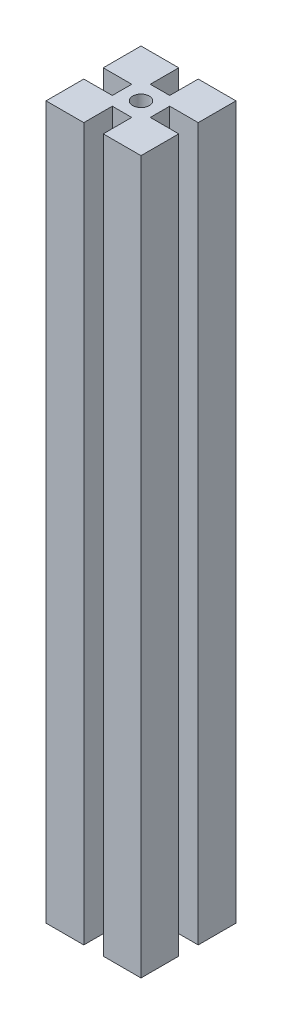
ISO-10303-21;
HEADER;
FILE_DESCRIPTION(('STEP AP214'),'2;1');
FILE_NAME('part.step','',(''),(''),'','','');
FILE_SCHEMA(('AUTOMOTIVE_DESIGN { 1 0 10303 214 1 1 1 1 }'));
ENDSEC;
DATA;
#1=APPLICATION_CONTEXT('core data for automotive mechanical design processes');
#2=APPLICATION_PROTOCOL_DEFINITION('international standard','automotive_design',2000,#1);
#3=PRODUCT_CONTEXT('',#1,'mechanical');
#4=PRODUCT('Part','Part','',(#3));
#5=PRODUCT_RELATED_PRODUCT_CATEGORY('part','',(#4));
#6=PRODUCT_DEFINITION_FORMATION('','',#4);
#7=PRODUCT_DEFINITION_CONTEXT('part definition',#1,'design');
#8=PRODUCT_DEFINITION('design','',#6,#7);
#9=PRODUCT_DEFINITION_SHAPE('','',#8);
#10=(LENGTH_UNIT() NAMED_UNIT(*) SI_UNIT(.MILLI.,.METRE.));
#11=(NAMED_UNIT(*) PLANE_ANGLE_UNIT() SI_UNIT($,.RADIAN.));
#12=(NAMED_UNIT(*) SI_UNIT($,.STERADIAN.) SOLID_ANGLE_UNIT());
#13=UNCERTAINTY_MEASURE_WITH_UNIT(LENGTH_MEASURE(1.E-05),#10,'distance_accuracy_value','');
#14=(GEOMETRIC_REPRESENTATION_CONTEXT(3) GLOBAL_UNCERTAINTY_ASSIGNED_CONTEXT((#13)) GLOBAL_UNIT_ASSIGNED_CONTEXT((#10,
#11,#12)) REPRESENTATION_CONTEXT('',''));
#15=CARTESIAN_POINT('',(0.,0.,0.));
#16=DIRECTION('',(0.,0.,1.));
#17=DIRECTION('',(1.,0.,0.));
#18=AXIS2_PLACEMENT_3D('',#15,#16,#17);
#19=CARTESIAN_POINT('',(0.,300.,0.));
#20=DIRECTION('',(0.,1.,0.));
#21=DIRECTION('',(0.,0.,1.));
#22=AXIS2_PLACEMENT_3D('',#19,#20,#21);
#23=PLANE('',#22);
#24=DIRECTION('',(0.,0.,-1.));
#25=VECTOR('',#24,1.);
#26=CARTESIAN_POINT('',(20.,300.,4.1));
#27=LINE('',#26,#25);
#28=CARTESIAN_POINT('',(20.,300.,20.));
#29=VERTEX_POINT('',#28);
#30=CARTESIAN_POINT('',(20.,300.,4.1));
#31=VERTEX_POINT('',#30);
#32=EDGE_CURVE('E241',#29,#31,#27,.T.);
#33=ORIENTED_EDGE('',*,*,#32,.T.);
#34=DIRECTION('',(-1.,0.,0.));
#35=VECTOR('',#34,1.);
#36=CARTESIAN_POINT('',(8.,300.,4.1));
#37=LINE('',#36,#35);
#38=CARTESIAN_POINT('',(8.,300.,4.1));
#39=VERTEX_POINT('',#38);
#40=EDGE_CURVE('E129',#31,#39,#37,.T.);
#41=ORIENTED_EDGE('',*,*,#40,.T.);
#42=DIRECTION('',(0.,0.,-1.));
#43=VECTOR('',#42,1.);
#44=CARTESIAN_POINT('',(8.,300.,-4.1));
#45=LINE('',#44,#43);
#46=CARTESIAN_POINT('',(8.,300.,-4.1));
#47=VERTEX_POINT('',#46);
#48=EDGE_CURVE('E292',#39,#47,#45,.T.);
#49=ORIENTED_EDGE('',*,*,#48,.T.);
#50=DIRECTION('',(1.,0.,0.));
#51=VECTOR('',#50,1.);
#52=CARTESIAN_POINT('',(20.,300.,-4.1));
#53=LINE('',#52,#51);
#54=CARTESIAN_POINT('',(20.,300.,-4.1));
#55=VERTEX_POINT('',#54);
#56=EDGE_CURVE('E311',#47,#55,#53,.T.);
#57=ORIENTED_EDGE('',*,*,#56,.T.);
#58=DIRECTION('',(0.,0.,-1.));
#59=VECTOR('',#58,1.);
#60=CARTESIAN_POINT('',(20.,300.,-20.));
#61=LINE('',#60,#59);
#62=CARTESIAN_POINT('',(20.,300.,-20.));
#63=VERTEX_POINT('',#62);
#64=EDGE_CURVE('E308',#55,#63,#61,.T.);
#65=ORIENTED_EDGE('',*,*,#64,.T.);
#66=DIRECTION('',(-1.,0.,0.));
#67=VECTOR('',#66,1.);
#68=CARTESIAN_POINT('',(4.10000000000001,300.,-20.));
#69=LINE('',#68,#67);
#70=CARTESIAN_POINT('',(4.10000000000001,300.,-20.));
#71=VERTEX_POINT('',#70);
#72=EDGE_CURVE('E310',#63,#71,#69,.T.);
#73=ORIENTED_EDGE('',*,*,#72,.T.);
#74=DIRECTION('',(0.,0.,1.));
#75=VECTOR('',#74,1.);
#76=CARTESIAN_POINT('',(4.10000000000001,300.,-7.99999999999999));
#77=LINE('',#76,#75);
#78=CARTESIAN_POINT('',(4.10000000000001,300.,-7.99999999999999));
#79=VERTEX_POINT('',#78);
#80=EDGE_CURVE('E313',#71,#79,#77,.T.);
#81=ORIENTED_EDGE('',*,*,#80,.T.);
#82=DIRECTION('',(-1.,0.,0.));
#83=VECTOR('',#82,1.);
#84=CARTESIAN_POINT('',(-4.09999999999999,300.,-7.99999999999999));
#85=LINE('',#84,#83);
#86=CARTESIAN_POINT('',(-4.09999999999999,300.,-7.99999999999999));
#87=VERTEX_POINT('',#86);
#88=EDGE_CURVE('E319',#79,#87,#85,.T.);
#89=ORIENTED_EDGE('',*,*,#88,.T.);
#90=DIRECTION('',(0.,0.,-1.));
#91=VECTOR('',#90,1.);
#92=CARTESIAN_POINT('',(-4.09999999999999,300.,-20.));
#93=LINE('',#92,#91);
#94=CARTESIAN_POINT('',(-4.09999999999999,300.,-20.));
#95=VERTEX_POINT('',#94);
#96=EDGE_CURVE('E321',#87,#95,#93,.T.);
#97=ORIENTED_EDGE('',*,*,#96,.T.);
#98=DIRECTION('',(-1.,0.,0.));
#99=VECTOR('',#98,1.);
#100=CARTESIAN_POINT('',(-20.,300.,-20.));
#101=LINE('',#100,#99);
#102=CARTESIAN_POINT('',(-20.,300.,-20.));
#103=VERTEX_POINT('',#102);
#104=EDGE_CURVE('E323',#95,#103,#101,.T.);
#105=ORIENTED_EDGE('',*,*,#104,.T.);
#106=DIRECTION('',(0.,0.,1.));
#107=VECTOR('',#106,1.);
#108=CARTESIAN_POINT('',(-20.,300.,-20.));
#109=LINE('',#108,#107);
#110=CARTESIAN_POINT('',(-20.,300.,-4.1));
#111=VERTEX_POINT('',#110);
#112=EDGE_CURVE('E325',#103,#111,#109,.T.);
#113=ORIENTED_EDGE('',*,*,#112,.T.);
#114=DIRECTION('',(1.,0.,0.));
#115=VECTOR('',#114,1.);
#116=CARTESIAN_POINT('',(-20.,300.,-4.1));
#117=LINE('',#116,#115);
#118=CARTESIAN_POINT('',(-8.,300.,-4.1));
#119=VERTEX_POINT('',#118);
#120=EDGE_CURVE('E327',#111,#119,#117,.T.);
#121=ORIENTED_EDGE('',*,*,#120,.T.);
#122=DIRECTION('',(0.,0.,1.));
#123=VECTOR('',#122,1.);
#124=CARTESIAN_POINT('',(-8.,300.,-4.1));
#125=LINE('',#124,#123);
#126=CARTESIAN_POINT('',(-8.,300.,4.1));
#127=VERTEX_POINT('',#126);
#128=EDGE_CURVE('E329',#119,#127,#125,.T.);
#129=ORIENTED_EDGE('',*,*,#128,.T.);
#130=DIRECTION('',(-1.,0.,0.));
#131=VECTOR('',#130,1.);
#132=CARTESIAN_POINT('',(-8.,300.,4.1));
#133=LINE('',#132,#131);
#134=CARTESIAN_POINT('',(-20.,300.,4.1));
#135=VERTEX_POINT('',#134);
#136=EDGE_CURVE('E331',#127,#135,#133,.T.);
#137=ORIENTED_EDGE('',*,*,#136,.T.);
#138=DIRECTION('',(0.,0.,1.));
#139=VECTOR('',#138,1.);
#140=CARTESIAN_POINT('',(-20.,300.,4.1));
#141=LINE('',#140,#139);
#142=CARTESIAN_POINT('',(-20.,300.,20.));
#143=VERTEX_POINT('',#142);
#144=EDGE_CURVE('E333',#135,#143,#141,.T.);
#145=ORIENTED_EDGE('',*,*,#144,.T.);
#146=DIRECTION('',(1.,0.,0.));
#147=VECTOR('',#146,1.);
#148=CARTESIAN_POINT('',(-20.,300.,20.));
#149=LINE('',#148,#147);
#150=CARTESIAN_POINT('',(-4.09999999999999,300.,20.));
#151=VERTEX_POINT('',#150);
#152=EDGE_CURVE('E335',#143,#151,#149,.T.);
#153=ORIENTED_EDGE('',*,*,#152,.T.);
#154=DIRECTION('',(0.,0.,-1.));
#155=VECTOR('',#154,1.);
#156=CARTESIAN_POINT('',(-4.09999999999999,300.,20.));
#157=LINE('',#156,#155);
#158=CARTESIAN_POINT('',(-4.09999999999999,300.,7.99999999999999));
#159=VERTEX_POINT('',#158);
#160=EDGE_CURVE('E184',#151,#159,#157,.T.);
#161=ORIENTED_EDGE('',*,*,#160,.T.);
#162=DIRECTION('',(1.,0.,0.));
#163=VECTOR('',#162,1.);
#164=CARTESIAN_POINT('',(-4.09999999999999,300.,7.99999999999999));
#165=LINE('',#164,#163);
#166=CARTESIAN_POINT('',(4.10000000000001,300.,7.99999999999999));
#167=VERTEX_POINT('',#166);
#168=EDGE_CURVE('E178',#159,#167,#165,.T.);
#169=ORIENTED_EDGE('',*,*,#168,.T.);
#170=DIRECTION('',(0.,0.,1.));
#171=VECTOR('',#170,1.);
#172=CARTESIAN_POINT('',(4.10000000000001,300.,7.99999999999999));
#173=LINE('',#172,#171);
#174=CARTESIAN_POINT('',(4.10000000000001,300.,20.));
#175=VERTEX_POINT('',#174);
#176=EDGE_CURVE('E182',#167,#175,#173,.T.);
#177=ORIENTED_EDGE('',*,*,#176,.T.);
#178=DIRECTION('',(1.,0.,0.));
#179=VECTOR('',#178,1.);
#180=CARTESIAN_POINT('',(4.10000000000001,300.,20.));
#181=LINE('',#180,#179);
#182=EDGE_CURVE('E50',#175,#29,#181,.T.);
#183=ORIENTED_EDGE('',*,*,#182,.T.);
#184=EDGE_LOOP('',(#33,#41,#49,#57,#65,#73,#81,#89,#97,#105,#113,#121,#129,#137,#145,#153,#161,
#169,#177,#183));
#185=FACE_BOUND('',#184,.T.);
#186=CARTESIAN_POINT('',(0.,300.,0.));
#187=DIRECTION('',(0.,1.,0.));
#188=DIRECTION('',(0.,0.,1.));
#189=AXIS2_PLACEMENT_3D('',#186,#187,#188);
#190=CIRCLE('',#189,3.5);
#191=CARTESIAN_POINT('',(0.,300.,3.49999999999999));
#192=VERTEX_POINT('',#191);
#193=EDGE_CURVE('E206',#192,#192,#190,.T.);
#194=ORIENTED_EDGE('',*,*,#193,.F.);
#195=EDGE_LOOP('',(#194));
#196=FACE_BOUND('',#195,.T.);
#197=ADVANCED_FACE('F33',(#185,#196),#23,.T.);
#198=CARTESIAN_POINT('',(0.,0.,0.));
#199=DIRECTION('',(0.,1.,0.));
#200=DIRECTION('',(0.,0.,1.));
#201=AXIS2_PLACEMENT_3D('',#198,#199,#200);
#202=PLANE('',#201);
#203=DIRECTION('',(0.,0.,-1.));
#204=VECTOR('',#203,1.);
#205=CARTESIAN_POINT('',(20.,0.,4.1));
#206=LINE('',#205,#204);
#207=CARTESIAN_POINT('',(20.,0.,20.));
#208=VERTEX_POINT('',#207);
#209=CARTESIAN_POINT('',(20.,0.,4.1));
#210=VERTEX_POINT('',#209);
#211=EDGE_CURVE('E202',#208,#210,#206,.T.);
#212=ORIENTED_EDGE('',*,*,#211,.F.);
#213=DIRECTION('',(1.,0.,0.));
#214=VECTOR('',#213,1.);
#215=CARTESIAN_POINT('',(4.10000000000001,0.,20.));
#216=LINE('',#215,#214);
#217=CARTESIAN_POINT('',(4.10000000000001,0.,20.));
#218=VERTEX_POINT('',#217);
#219=EDGE_CURVE('E121',#218,#208,#216,.T.);
#220=ORIENTED_EDGE('',*,*,#219,.F.);
#221=DIRECTION('',(0.,0.,1.));
#222=VECTOR('',#221,1.);
#223=CARTESIAN_POINT('',(4.10000000000001,0.,7.99999999999999));
#224=LINE('',#223,#222);
#225=CARTESIAN_POINT('',(4.10000000000001,0.,7.99999999999999));
#226=VERTEX_POINT('',#225);
#227=EDGE_CURVE('E115',#226,#218,#224,.T.);
#228=ORIENTED_EDGE('',*,*,#227,.F.);
#229=DIRECTION('',(1.,0.,0.));
#230=VECTOR('',#229,1.);
#231=CARTESIAN_POINT('',(-4.09999999999999,0.,7.99999999999999));
#232=LINE('',#231,#230);
#233=CARTESIAN_POINT('',(-4.09999999999999,0.,7.99999999999999));
#234=VERTEX_POINT('',#233);
#235=EDGE_CURVE('E192',#234,#226,#232,.T.);
#236=ORIENTED_EDGE('',*,*,#235,.F.);
#237=DIRECTION('',(0.,0.,-1.));
#238=VECTOR('',#237,1.);
#239=CARTESIAN_POINT('',(-4.09999999999999,0.,20.));
#240=LINE('',#239,#238);
#241=CARTESIAN_POINT('',(-4.09999999999999,0.,20.));
#242=VERTEX_POINT('',#241);
#243=EDGE_CURVE('E236',#242,#234,#240,.T.);
#244=ORIENTED_EDGE('',*,*,#243,.F.);
#245=DIRECTION('',(1.,0.,0.));
#246=VECTOR('',#245,1.);
#247=CARTESIAN_POINT('',(-20.,0.,20.));
#248=LINE('',#247,#246);
#249=CARTESIAN_POINT('',(-20.,0.,20.));
#250=VERTEX_POINT('',#249);
#251=EDGE_CURVE('E234',#250,#242,#248,.T.);
#252=ORIENTED_EDGE('',*,*,#251,.F.);
#253=DIRECTION('',(0.,0.,1.));
#254=VECTOR('',#253,1.);
#255=CARTESIAN_POINT('',(-20.,0.,4.1));
#256=LINE('',#255,#254);
#257=CARTESIAN_POINT('',(-20.,0.,4.1));
#258=VERTEX_POINT('',#257);
#259=EDGE_CURVE('E232',#258,#250,#256,.T.);
#260=ORIENTED_EDGE('',*,*,#259,.F.);
#261=DIRECTION('',(-1.,0.,0.));
#262=VECTOR('',#261,1.);
#263=CARTESIAN_POINT('',(-8.,0.,4.1));
#264=LINE('',#263,#262);
#265=CARTESIAN_POINT('',(-8.,0.,4.1));
#266=VERTEX_POINT('',#265);
#267=EDGE_CURVE('E230',#266,#258,#264,.T.);
#268=ORIENTED_EDGE('',*,*,#267,.F.);
#269=DIRECTION('',(0.,0.,1.));
#270=VECTOR('',#269,1.);
#271=CARTESIAN_POINT('',(-8.,0.,-4.1));
#272=LINE('',#271,#270);
#273=CARTESIAN_POINT('',(-8.,0.,-4.1));
#274=VERTEX_POINT('',#273);
#275=EDGE_CURVE('E228',#274,#266,#272,.T.);
#276=ORIENTED_EDGE('',*,*,#275,.F.);
#277=DIRECTION('',(1.,0.,0.));
#278=VECTOR('',#277,1.);
#279=CARTESIAN_POINT('',(-20.,0.,-4.1));
#280=LINE('',#279,#278);
#281=CARTESIAN_POINT('',(-20.,0.,-4.1));
#282=VERTEX_POINT('',#281);
#283=EDGE_CURVE('E226',#282,#274,#280,.T.);
#284=ORIENTED_EDGE('',*,*,#283,.F.);
#285=DIRECTION('',(0.,0.,1.));
#286=VECTOR('',#285,1.);
#287=CARTESIAN_POINT('',(-20.,0.,-20.));
#288=LINE('',#287,#286);
#289=CARTESIAN_POINT('',(-20.,0.,-20.));
#290=VERTEX_POINT('',#289);
#291=EDGE_CURVE('E224',#290,#282,#288,.T.);
#292=ORIENTED_EDGE('',*,*,#291,.F.);
#293=DIRECTION('',(-1.,0.,0.));
#294=VECTOR('',#293,1.);
#295=CARTESIAN_POINT('',(-20.,0.,-20.));
#296=LINE('',#295,#294);
#297=CARTESIAN_POINT('',(-4.09999999999999,0.,-20.));
#298=VERTEX_POINT('',#297);
#299=EDGE_CURVE('E222',#298,#290,#296,.T.);
#300=ORIENTED_EDGE('',*,*,#299,.F.);
#301=DIRECTION('',(0.,0.,-1.));
#302=VECTOR('',#301,1.);
#303=CARTESIAN_POINT('',(-4.09999999999999,0.,-20.));
#304=LINE('',#303,#302);
#305=CARTESIAN_POINT('',(-4.09999999999999,0.,-7.99999999999999));
#306=VERTEX_POINT('',#305);
#307=EDGE_CURVE('E220',#306,#298,#304,.T.);
#308=ORIENTED_EDGE('',*,*,#307,.F.);
#309=DIRECTION('',(-1.,0.,0.));
#310=VECTOR('',#309,1.);
#311=CARTESIAN_POINT('',(-4.09999999999999,0.,-7.99999999999999));
#312=LINE('',#311,#310);
#313=CARTESIAN_POINT('',(4.10000000000001,0.,-7.99999999999999));
#314=VERTEX_POINT('',#313);
#315=EDGE_CURVE('E218',#314,#306,#312,.T.);
#316=ORIENTED_EDGE('',*,*,#315,.F.);
#317=DIRECTION('',(0.,0.,1.));
#318=VECTOR('',#317,1.);
#319=CARTESIAN_POINT('',(4.10000000000001,0.,-7.99999999999999));
#320=LINE('',#319,#318);
#321=CARTESIAN_POINT('',(4.10000000000001,0.,-20.));
#322=VERTEX_POINT('',#321);
#323=EDGE_CURVE('E216',#322,#314,#320,.T.);
#324=ORIENTED_EDGE('',*,*,#323,.F.);
#325=DIRECTION('',(-1.,0.,0.));
#326=VECTOR('',#325,1.);
#327=CARTESIAN_POINT('',(4.10000000000001,0.,-20.));
#328=LINE('',#327,#326);
#329=CARTESIAN_POINT('',(20.,0.,-20.));
#330=VERTEX_POINT('',#329);
#331=EDGE_CURVE('E214',#330,#322,#328,.T.);
#332=ORIENTED_EDGE('',*,*,#331,.F.);
#333=DIRECTION('',(0.,0.,-1.));
#334=VECTOR('',#333,1.);
#335=CARTESIAN_POINT('',(20.,0.,-20.));
#336=LINE('',#335,#334);
#337=CARTESIAN_POINT('',(20.,0.,-4.1));
#338=VERTEX_POINT('',#337);
#339=EDGE_CURVE('E212',#338,#330,#336,.T.);
#340=ORIENTED_EDGE('',*,*,#339,.F.);
#341=DIRECTION('',(1.,0.,0.));
#342=VECTOR('',#341,1.);
#343=CARTESIAN_POINT('',(20.,0.,-4.1));
#344=LINE('',#343,#342);
#345=CARTESIAN_POINT('',(8.,0.,-4.1));
#346=VERTEX_POINT('',#345);
#347=EDGE_CURVE('E210',#346,#338,#344,.T.);
#348=ORIENTED_EDGE('',*,*,#347,.F.);
#349=DIRECTION('',(0.,0.,-1.));
#350=VECTOR('',#349,1.);
#351=CARTESIAN_POINT('',(8.,0.,-4.1));
#352=LINE('',#351,#350);
#353=CARTESIAN_POINT('',(8.,0.,4.1));
#354=VERTEX_POINT('',#353);
#355=EDGE_CURVE('E208',#354,#346,#352,.T.);
#356=ORIENTED_EDGE('',*,*,#355,.F.);
#357=DIRECTION('',(-1.,0.,0.));
#358=VECTOR('',#357,1.);
#359=CARTESIAN_POINT('',(8.,0.,4.1));
#360=LINE('',#359,#358);
#361=EDGE_CURVE('E205',#210,#354,#360,.T.);
#362=ORIENTED_EDGE('',*,*,#361,.F.);
#363=EDGE_LOOP('',(#212,#220,#228,#236,#244,#252,#260,#268,#276,#284,#292,#300,#308,#316,#324,
#332,#340,#348,#356,#362));
#364=FACE_BOUND('',#363,.T.);
#365=CARTESIAN_POINT('',(0.,0.,0.));
#366=DIRECTION('',(0.,1.,0.));
#367=DIRECTION('',(0.,0.,1.));
#368=AXIS2_PLACEMENT_3D('',#365,#366,#367);
#369=CIRCLE('',#368,3.5);
#370=CARTESIAN_POINT('',(0.,0.,3.49999999999999));
#371=VERTEX_POINT('',#370);
#372=EDGE_CURVE('E586',#371,#371,#369,.T.);
#373=ORIENTED_EDGE('',*,*,#372,.T.);
#374=EDGE_LOOP('',(#373));
#375=FACE_BOUND('',#374,.T.);
#376=ADVANCED_FACE('F296',(#364,#375),#202,.F.);
#377=CARTESIAN_POINT('',(20.,300.,4.1));
#378=DIRECTION('',(-1.,0.,0.));
#379=DIRECTION('',(0.,0.,1.));
#380=AXIS2_PLACEMENT_3D('',#377,#378,#379);
#381=PLANE('',#380);
#382=ORIENTED_EDGE('',*,*,#211,.T.);
#383=DIRECTION('',(0.,-1.,0.));
#384=VECTOR('',#383,1.);
#385=CARTESIAN_POINT('',(20.,300.,4.1));
#386=LINE('',#385,#384);
#387=EDGE_CURVE('E11',#31,#210,#386,.T.);
#388=ORIENTED_EDGE('',*,*,#387,.F.);
#389=ORIENTED_EDGE('',*,*,#32,.F.);
#390=DIRECTION('',(0.,-1.,0.));
#391=VECTOR('',#390,1.);
#392=CARTESIAN_POINT('',(20.,300.,20.));
#393=LINE('',#392,#391);
#394=EDGE_CURVE('E198',#29,#208,#393,.T.);
#395=ORIENTED_EDGE('',*,*,#394,.T.);
#396=EDGE_LOOP('',(#382,#388,#389,#395));
#397=FACE_BOUND('',#396,.T.);
#398=ADVANCED_FACE('F35',(#397),#381,.F.);
#399=CARTESIAN_POINT('',(8.,300.,4.1));
#400=DIRECTION('',(0.,0.,1.));
#401=DIRECTION('',(1.,0.,0.));
#402=AXIS2_PLACEMENT_3D('',#399,#400,#401);
#403=PLANE('',#402);
#404=ORIENTED_EDGE('',*,*,#361,.T.);
#405=DIRECTION('',(0.,-1.,0.));
#406=VECTOR('',#405,1.);
#407=CARTESIAN_POINT('',(8.,300.,4.1));
#408=LINE('',#407,#406);
#409=EDGE_CURVE('E42',#39,#354,#408,.T.);
#410=ORIENTED_EDGE('',*,*,#409,.F.);
#411=ORIENTED_EDGE('',*,*,#40,.F.);
#412=ORIENTED_EDGE('',*,*,#387,.T.);
#413=EDGE_LOOP('',(#404,#410,#411,#412));
#414=FACE_BOUND('',#413,.T.);
#415=ADVANCED_FACE('F369',(#414),#403,.F.);
#416=CARTESIAN_POINT('',(8.,300.,-4.1));
#417=DIRECTION('',(-1.,0.,0.));
#418=DIRECTION('',(0.,0.,1.));
#419=AXIS2_PLACEMENT_3D('',#416,#417,#418);
#420=PLANE('',#419);
#421=ORIENTED_EDGE('',*,*,#355,.T.);
#422=DIRECTION('',(0.,-1.,0.));
#423=VECTOR('',#422,1.);
#424=CARTESIAN_POINT('',(8.,300.,-4.1));
#425=LINE('',#424,#423);
#426=EDGE_CURVE('E284',#47,#346,#425,.T.);
#427=ORIENTED_EDGE('',*,*,#426,.F.);
#428=ORIENTED_EDGE('',*,*,#48,.F.);
#429=ORIENTED_EDGE('',*,*,#409,.T.);
#430=EDGE_LOOP('',(#421,#427,#428,#429));
#431=FACE_BOUND('',#430,.T.);
#432=ADVANCED_FACE('F290',(#431),#420,.F.);
#433=CARTESIAN_POINT('',(20.,300.,-4.1));
#434=DIRECTION('',(0.,0.,-1.));
#435=DIRECTION('',(-1.,0.,0.));
#436=AXIS2_PLACEMENT_3D('',#433,#434,#435);
#437=PLANE('',#436);
#438=ORIENTED_EDGE('',*,*,#347,.T.);
#439=DIRECTION('',(0.,-1.,0.));
#440=VECTOR('',#439,1.);
#441=CARTESIAN_POINT('',(20.,300.,-4.1));
#442=LINE('',#441,#440);
#443=EDGE_CURVE('E281',#55,#338,#442,.T.);
#444=ORIENTED_EDGE('',*,*,#443,.F.);
#445=ORIENTED_EDGE('',*,*,#56,.F.);
#446=ORIENTED_EDGE('',*,*,#426,.T.);
#447=EDGE_LOOP('',(#438,#444,#445,#446));
#448=FACE_BOUND('',#447,.T.);
#449=ADVANCED_FACE('F302',(#448),#437,.F.);
#450=CARTESIAN_POINT('',(20.,300.,-20.));
#451=DIRECTION('',(-1.,0.,0.));
#452=DIRECTION('',(0.,0.,1.));
#453=AXIS2_PLACEMENT_3D('',#450,#451,#452);
#454=PLANE('',#453);
#455=ORIENTED_EDGE('',*,*,#339,.T.);
#456=DIRECTION('',(0.,-1.,0.));
#457=VECTOR('',#456,1.);
#458=CARTESIAN_POINT('',(20.,300.,-20.));
#459=LINE('',#458,#457);
#460=EDGE_CURVE('E278',#63,#330,#459,.T.);
#461=ORIENTED_EDGE('',*,*,#460,.F.);
#462=ORIENTED_EDGE('',*,*,#64,.F.);
#463=ORIENTED_EDGE('',*,*,#443,.T.);
#464=EDGE_LOOP('',(#455,#461,#462,#463));
#465=FACE_BOUND('',#464,.T.);
#466=ADVANCED_FACE('F306',(#465),#454,.F.);
#467=CARTESIAN_POINT('',(4.10000000000001,300.,-20.));
#468=DIRECTION('',(0.,0.,1.));
#469=DIRECTION('',(1.,0.,0.));
#470=AXIS2_PLACEMENT_3D('',#467,#468,#469);
#471=PLANE('',#470);
#472=ORIENTED_EDGE('',*,*,#331,.T.);
#473=DIRECTION('',(0.,-1.,0.));
#474=VECTOR('',#473,1.);
#475=CARTESIAN_POINT('',(4.10000000000001,300.,-20.));
#476=LINE('',#475,#474);
#477=EDGE_CURVE('E275',#71,#322,#476,.T.);
#478=ORIENTED_EDGE('',*,*,#477,.F.);
#479=ORIENTED_EDGE('',*,*,#72,.F.);
#480=ORIENTED_EDGE('',*,*,#460,.T.);
#481=EDGE_LOOP('',(#472,#478,#479,#480));
#482=FACE_BOUND('',#481,.T.);
#483=ADVANCED_FACE('F382',(#482),#471,.F.);
#484=CARTESIAN_POINT('',(4.10000000000001,300.,-7.99999999999999));
#485=DIRECTION('',(1.,0.,0.));
#486=DIRECTION('',(0.,0.,-1.));
#487=AXIS2_PLACEMENT_3D('',#484,#485,#486);
#488=PLANE('',#487);
#489=ORIENTED_EDGE('',*,*,#323,.T.);
#490=DIRECTION('',(0.,-1.,0.));
#491=VECTOR('',#490,1.);
#492=CARTESIAN_POINT('',(4.10000000000001,300.,-7.99999999999999));
#493=LINE('',#492,#491);
#494=EDGE_CURVE('E272',#79,#314,#493,.T.);
#495=ORIENTED_EDGE('',*,*,#494,.F.);
#496=ORIENTED_EDGE('',*,*,#80,.F.);
#497=ORIENTED_EDGE('',*,*,#477,.T.);
#498=EDGE_LOOP('',(#489,#495,#496,#497));
#499=FACE_BOUND('',#498,.T.);
#500=ADVANCED_FACE('F385',(#499),#488,.F.);
#501=CARTESIAN_POINT('',(-4.09999999999999,300.,-7.99999999999999));
#502=DIRECTION('',(0.,0.,1.));
#503=DIRECTION('',(1.,0.,0.));
#504=AXIS2_PLACEMENT_3D('',#501,#502,#503);
#505=PLANE('',#504);
#506=ORIENTED_EDGE('',*,*,#315,.T.);
#507=DIRECTION('',(0.,-1.,0.));
#508=VECTOR('',#507,1.);
#509=CARTESIAN_POINT('',(-4.09999999999999,300.,-7.99999999999999));
#510=LINE('',#509,#508);
#511=EDGE_CURVE('E269',#87,#306,#510,.T.);
#512=ORIENTED_EDGE('',*,*,#511,.F.);
#513=ORIENTED_EDGE('',*,*,#88,.F.);
#514=ORIENTED_EDGE('',*,*,#494,.T.);
#515=EDGE_LOOP('',(#506,#512,#513,#514));
#516=FACE_BOUND('',#515,.T.);
#517=ADVANCED_FACE('F389',(#516),#505,.F.);
#518=CARTESIAN_POINT('',(-4.09999999999999,300.,-20.));
#519=DIRECTION('',(-1.,0.,0.));
#520=DIRECTION('',(0.,0.,1.));
#521=AXIS2_PLACEMENT_3D('',#518,#519,#520);
#522=PLANE('',#521);
#523=ORIENTED_EDGE('',*,*,#307,.T.);
#524=DIRECTION('',(0.,-1.,0.));
#525=VECTOR('',#524,1.);
#526=CARTESIAN_POINT('',(-4.09999999999999,300.,-20.));
#527=LINE('',#526,#525);
#528=EDGE_CURVE('E266',#95,#298,#527,.T.);
#529=ORIENTED_EDGE('',*,*,#528,.F.);
#530=ORIENTED_EDGE('',*,*,#96,.F.);
#531=ORIENTED_EDGE('',*,*,#511,.T.);
#532=EDGE_LOOP('',(#523,#529,#530,#531));
#533=FACE_BOUND('',#532,.T.);
#534=ADVANCED_FACE('F393',(#533),#522,.F.);
#535=CARTESIAN_POINT('',(-20.,300.,-20.));
#536=DIRECTION('',(0.,0.,1.));
#537=DIRECTION('',(1.,0.,0.));
#538=AXIS2_PLACEMENT_3D('',#535,#536,#537);
#539=PLANE('',#538);
#540=ORIENTED_EDGE('',*,*,#299,.T.);
#541=DIRECTION('',(0.,-1.,0.));
#542=VECTOR('',#541,1.);
#543=CARTESIAN_POINT('',(-20.,300.,-20.));
#544=LINE('',#543,#542);
#545=EDGE_CURVE('E263',#103,#290,#544,.T.);
#546=ORIENTED_EDGE('',*,*,#545,.F.);
#547=ORIENTED_EDGE('',*,*,#104,.F.);
#548=ORIENTED_EDGE('',*,*,#528,.T.);
#549=EDGE_LOOP('',(#540,#546,#547,#548));
#550=FACE_BOUND('',#549,.T.);
#551=ADVANCED_FACE('F397',(#550),#539,.F.);
#552=CARTESIAN_POINT('',(-20.,300.,-20.));
#553=DIRECTION('',(1.,0.,0.));
#554=DIRECTION('',(0.,0.,-1.));
#555=AXIS2_PLACEMENT_3D('',#552,#553,#554);
#556=PLANE('',#555);
#557=ORIENTED_EDGE('',*,*,#291,.T.);
#558=DIRECTION('',(0.,-1.,0.));
#559=VECTOR('',#558,1.);
#560=CARTESIAN_POINT('',(-20.,300.,-4.1));
#561=LINE('',#560,#559);
#562=EDGE_CURVE('E260',#111,#282,#561,.T.);
#563=ORIENTED_EDGE('',*,*,#562,.F.);
#564=ORIENTED_EDGE('',*,*,#112,.F.);
#565=ORIENTED_EDGE('',*,*,#545,.T.);
#566=EDGE_LOOP('',(#557,#563,#564,#565));
#567=FACE_BOUND('',#566,.T.);
#568=ADVANCED_FACE('F401',(#567),#556,.F.);
#569=CARTESIAN_POINT('',(-20.,300.,-4.1));
#570=DIRECTION('',(0.,0.,-1.));
#571=DIRECTION('',(-1.,0.,0.));
#572=AXIS2_PLACEMENT_3D('',#569,#570,#571);
#573=PLANE('',#572);
#574=ORIENTED_EDGE('',*,*,#283,.T.);
#575=DIRECTION('',(0.,-1.,0.));
#576=VECTOR('',#575,1.);
#577=CARTESIAN_POINT('',(-8.,300.,-4.1));
#578=LINE('',#577,#576);
#579=EDGE_CURVE('E257',#119,#274,#578,.T.);
#580=ORIENTED_EDGE('',*,*,#579,.F.);
#581=ORIENTED_EDGE('',*,*,#120,.F.);
#582=ORIENTED_EDGE('',*,*,#562,.T.);
#583=EDGE_LOOP('',(#574,#580,#581,#582));
#584=FACE_BOUND('',#583,.T.);
#585=ADVANCED_FACE('F405',(#584),#573,.F.);
#586=CARTESIAN_POINT('',(-8.,300.,-4.1));
#587=DIRECTION('',(1.,0.,0.));
#588=DIRECTION('',(0.,0.,-1.));
#589=AXIS2_PLACEMENT_3D('',#586,#587,#588);
#590=PLANE('',#589);
#591=ORIENTED_EDGE('',*,*,#275,.T.);
#592=DIRECTION('',(0.,-1.,0.));
#593=VECTOR('',#592,1.);
#594=CARTESIAN_POINT('',(-8.,300.,4.1));
#595=LINE('',#594,#593);
#596=EDGE_CURVE('E254',#127,#266,#595,.T.);
#597=ORIENTED_EDGE('',*,*,#596,.F.);
#598=ORIENTED_EDGE('',*,*,#128,.F.);
#599=ORIENTED_EDGE('',*,*,#579,.T.);
#600=EDGE_LOOP('',(#591,#597,#598,#599));
#601=FACE_BOUND('',#600,.T.);
#602=ADVANCED_FACE('F409',(#601),#590,.F.);
#603=CARTESIAN_POINT('',(-8.,300.,4.1));
#604=DIRECTION('',(0.,0.,1.));
#605=DIRECTION('',(1.,0.,0.));
#606=AXIS2_PLACEMENT_3D('',#603,#604,#605);
#607=PLANE('',#606);
#608=ORIENTED_EDGE('',*,*,#267,.T.);
#609=DIRECTION('',(0.,-1.,0.));
#610=VECTOR('',#609,1.);
#611=CARTESIAN_POINT('',(-20.,300.,4.1));
#612=LINE('',#611,#610);
#613=EDGE_CURVE('E251',#135,#258,#612,.T.);
#614=ORIENTED_EDGE('',*,*,#613,.F.);
#615=ORIENTED_EDGE('',*,*,#136,.F.);
#616=ORIENTED_EDGE('',*,*,#596,.T.);
#617=EDGE_LOOP('',(#608,#614,#615,#616));
#618=FACE_BOUND('',#617,.T.);
#619=ADVANCED_FACE('F413',(#618),#607,.F.);
#620=CARTESIAN_POINT('',(-20.,300.,4.1));
#621=DIRECTION('',(1.,0.,0.));
#622=DIRECTION('',(0.,0.,-1.));
#623=AXIS2_PLACEMENT_3D('',#620,#621,#622);
#624=PLANE('',#623);
#625=ORIENTED_EDGE('',*,*,#259,.T.);
#626=DIRECTION('',(0.,-1.,0.));
#627=VECTOR('',#626,1.);
#628=CARTESIAN_POINT('',(-20.,300.,20.));
#629=LINE('',#628,#627);
#630=EDGE_CURVE('E248',#143,#250,#629,.T.);
#631=ORIENTED_EDGE('',*,*,#630,.F.);
#632=ORIENTED_EDGE('',*,*,#144,.F.);
#633=ORIENTED_EDGE('',*,*,#613,.T.);
#634=EDGE_LOOP('',(#625,#631,#632,#633));
#635=FACE_BOUND('',#634,.T.);
#636=ADVANCED_FACE('F417',(#635),#624,.F.);
#637=CARTESIAN_POINT('',(-20.,300.,20.));
#638=DIRECTION('',(0.,0.,-1.));
#639=DIRECTION('',(-1.,0.,0.));
#640=AXIS2_PLACEMENT_3D('',#637,#638,#639);
#641=PLANE('',#640);
#642=ORIENTED_EDGE('',*,*,#251,.T.);
#643=DIRECTION('',(0.,-1.,0.));
#644=VECTOR('',#643,1.);
#645=CARTESIAN_POINT('',(-4.09999999999999,300.,20.));
#646=LINE('',#645,#644);
#647=EDGE_CURVE('E245',#151,#242,#646,.T.);
#648=ORIENTED_EDGE('',*,*,#647,.F.);
#649=ORIENTED_EDGE('',*,*,#152,.F.);
#650=ORIENTED_EDGE('',*,*,#630,.T.);
#651=EDGE_LOOP('',(#642,#648,#649,#650));
#652=FACE_BOUND('',#651,.T.);
#653=ADVANCED_FACE('F341',(#652),#641,.F.);
#654=CARTESIAN_POINT('',(-4.09999999999999,300.,20.));
#655=DIRECTION('',(-1.,0.,0.));
#656=DIRECTION('',(0.,0.,1.));
#657=AXIS2_PLACEMENT_3D('',#654,#655,#656);
#658=PLANE('',#657);
#659=ORIENTED_EDGE('',*,*,#243,.T.);
#660=DIRECTION('',(0.,-1.,0.));
#661=VECTOR('',#660,1.);
#662=CARTESIAN_POINT('',(-4.09999999999999,300.,7.99999999999999));
#663=LINE('',#662,#661);
#664=EDGE_CURVE('E193',#159,#234,#663,.T.);
#665=ORIENTED_EDGE('',*,*,#664,.F.);
#666=ORIENTED_EDGE('',*,*,#160,.F.);
#667=ORIENTED_EDGE('',*,*,#647,.T.);
#668=EDGE_LOOP('',(#659,#665,#666,#667));
#669=FACE_BOUND('',#668,.T.);
#670=ADVANCED_FACE('F345',(#669),#658,.F.);
#671=CARTESIAN_POINT('',(-4.09999999999999,300.,7.99999999999999));
#672=DIRECTION('',(0.,0.,-1.));
#673=DIRECTION('',(-1.,0.,0.));
#674=AXIS2_PLACEMENT_3D('',#671,#672,#673);
#675=PLANE('',#674);
#676=ORIENTED_EDGE('',*,*,#235,.T.);
#677=DIRECTION('',(0.,-1.,0.));
#678=VECTOR('',#677,1.);
#679=CARTESIAN_POINT('',(4.10000000000001,300.,7.99999999999999));
#680=LINE('',#679,#678);
#681=EDGE_CURVE('E189',#167,#226,#680,.T.);
#682=ORIENTED_EDGE('',*,*,#681,.F.);
#683=ORIENTED_EDGE('',*,*,#168,.F.);
#684=ORIENTED_EDGE('',*,*,#664,.T.);
#685=EDGE_LOOP('',(#676,#682,#683,#684));
#686=FACE_BOUND('',#685,.T.);
#687=ADVANCED_FACE('F190',(#686),#675,.F.);
#688=CARTESIAN_POINT('',(4.10000000000001,300.,7.99999999999999));
#689=DIRECTION('',(1.,0.,0.));
#690=DIRECTION('',(0.,0.,-1.));
#691=AXIS2_PLACEMENT_3D('',#688,#689,#690);
#692=PLANE('',#691);
#693=ORIENTED_EDGE('',*,*,#227,.T.);
#694=DIRECTION('',(0.,-1.,0.));
#695=VECTOR('',#694,1.);
#696=CARTESIAN_POINT('',(4.10000000000001,300.,20.));
#697=LINE('',#696,#695);
#698=EDGE_CURVE('E194',#175,#218,#697,.T.);
#699=ORIENTED_EDGE('',*,*,#698,.F.);
#700=ORIENTED_EDGE('',*,*,#176,.F.);
#701=ORIENTED_EDGE('',*,*,#681,.T.);
#702=EDGE_LOOP('',(#693,#699,#700,#701));
#703=FACE_BOUND('',#702,.T.);
#704=ADVANCED_FACE('F196',(#703),#692,.F.);
#705=CARTESIAN_POINT('',(4.10000000000001,300.,20.));
#706=DIRECTION('',(0.,0.,-1.));
#707=DIRECTION('',(-1.,0.,0.));
#708=AXIS2_PLACEMENT_3D('',#705,#706,#707);
#709=PLANE('',#708);
#710=ORIENTED_EDGE('',*,*,#219,.T.);
#711=ORIENTED_EDGE('',*,*,#394,.F.);
#712=ORIENTED_EDGE('',*,*,#182,.F.);
#713=ORIENTED_EDGE('',*,*,#698,.T.);
#714=EDGE_LOOP('',(#710,#711,#712,#713));
#715=FACE_BOUND('',#714,.T.);
#716=ADVANCED_FACE('F349',(#715),#709,.F.);
#717=CARTESIAN_POINT('',(0.,300.,0.));
#718=DIRECTION('',(0.,-1.,0.));
#719=DIRECTION('',(0.,0.,-1.));
#720=AXIS2_PLACEMENT_3D('',#717,#718,#719);
#721=CYLINDRICAL_SURFACE('',#720,3.5);
#722=ORIENTED_EDGE('',*,*,#193,.T.);
#723=EDGE_LOOP('',(#722));
#724=FACE_BOUND('',#723,.T.);
#725=ORIENTED_EDGE('',*,*,#372,.F.);
#726=EDGE_LOOP('',(#725));
#727=FACE_BOUND('',#726,.T.);
#728=ADVANCED_FACE('F351',(#724,#727),#721,.F.);
#729=CLOSED_SHELL('',(#197,#376,#398,#415,#432,#449,#466,#483,#500,#517,#534,#551,#568,#585,
#602,#619,#636,#653,#670,#687,#704,#716,#728));
#730=MANIFOLD_SOLID_BREP('B2',#729);
#731=ADVANCED_BREP_SHAPE_REPRESENTATION('',(#18,#730),#14);
#732=SHAPE_DEFINITION_REPRESENTATION(#9,#731);
ENDSEC;
END-ISO-10303-21;
